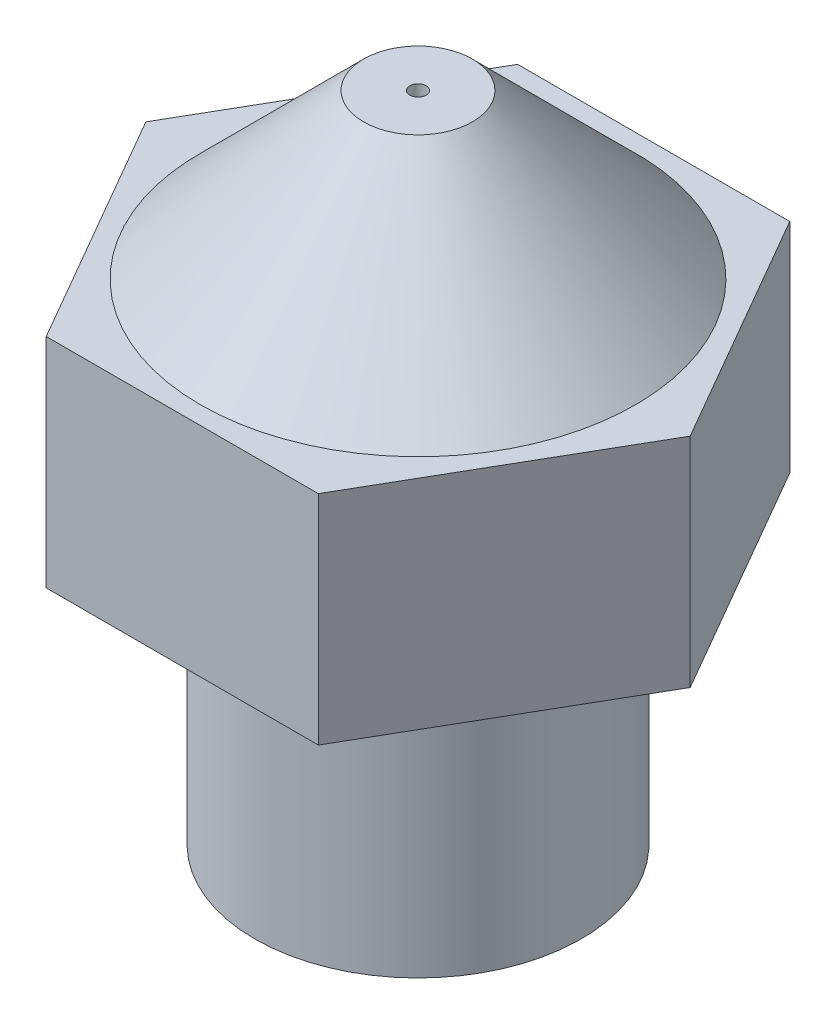
ISO-10303-21;
HEADER;
FILE_DESCRIPTION(('STEP AP214'),'2;1');
FILE_NAME('part.step','',(''),(''),'','','');
FILE_SCHEMA(('AUTOMOTIVE_DESIGN { 1 0 10303 214 1 1 1 1 }'));
ENDSEC;
DATA;
#1=APPLICATION_CONTEXT('core data for automotive mechanical design processes');
#2=APPLICATION_PROTOCOL_DEFINITION('international standard','automotive_design',2000,#1);
#3=PRODUCT_CONTEXT('',#1,'mechanical');
#4=PRODUCT('Part','Part','',(#3));
#5=PRODUCT_RELATED_PRODUCT_CATEGORY('part','',(#4));
#6=PRODUCT_DEFINITION_FORMATION('','',#4);
#7=PRODUCT_DEFINITION_CONTEXT('part definition',#1,'design');
#8=PRODUCT_DEFINITION('design','',#6,#7);
#9=PRODUCT_DEFINITION_SHAPE('','',#8);
#10=(LENGTH_UNIT() NAMED_UNIT(*) SI_UNIT(.MILLI.,.METRE.));
#11=(NAMED_UNIT(*) PLANE_ANGLE_UNIT() SI_UNIT($,.RADIAN.));
#12=(NAMED_UNIT(*) SI_UNIT($,.STERADIAN.) SOLID_ANGLE_UNIT());
#13=UNCERTAINTY_MEASURE_WITH_UNIT(LENGTH_MEASURE(1.E-05),#10,'distance_accuracy_value','');
#14=(GEOMETRIC_REPRESENTATION_CONTEXT(3) GLOBAL_UNCERTAINTY_ASSIGNED_CONTEXT((#13)) GLOBAL_UNIT_ASSIGNED_CONTEXT((#10,
#11,#12)) REPRESENTATION_CONTEXT('',''));
#15=CARTESIAN_POINT('',(0.,0.,0.));
#16=DIRECTION('',(0.,0.,1.));
#17=DIRECTION('',(1.,0.,0.));
#18=AXIS2_PLACEMENT_3D('',#15,#16,#17);
#19=CARTESIAN_POINT('',(0.,-38.,0.));
#20=DIRECTION('',(0.,1.,0.));
#21=DIRECTION('',(0.,0.,1.));
#22=AXIS2_PLACEMENT_3D('',#19,#20,#21);
#23=CYLINDRICAL_SURFACE('',#22,0.150000000000001);
#24=CARTESIAN_POINT('',(0.,12.,0.));
#25=DIRECTION('',(0.,1.,0.));
#26=DIRECTION('',(0.,0.,1.));
#27=AXIS2_PLACEMENT_3D('',#24,#25,#26);
#28=CIRCLE('',#27,0.150000000000001);
#29=CARTESIAN_POINT('',(0.,12.,0.150000000000001));
#30=VERTEX_POINT('',#29);
#31=EDGE_CURVE('E144',#30,#30,#28,.T.);
#32=ORIENTED_EDGE('',*,*,#31,.T.);
#33=EDGE_LOOP('',(#32));
#34=FACE_BOUND('',#33,.T.);
#35=CARTESIAN_POINT('',(0.,5.,0.));
#36=DIRECTION('',(0.,-1.,0.));
#37=DIRECTION('',(0.,0.,-1.));
#38=AXIS2_PLACEMENT_3D('',#35,#36,#37);
#39=CIRCLE('',#38,0.150000000000001);
#40=CARTESIAN_POINT('',(0.,5.,-0.150000000000001));
#41=VERTEX_POINT('',#40);
#42=EDGE_CURVE('E37',#41,#41,#39,.F.);
#43=ORIENTED_EDGE('',*,*,#42,.F.);
#44=EDGE_LOOP('',(#43));
#45=FACE_BOUND('',#44,.T.);
#46=ADVANCED_FACE('F33',(#34,#45),#23,.F.);
#47=CARTESIAN_POINT('',(0.,5.,0.));
#48=DIRECTION('',(0.,-1.,0.));
#49=DIRECTION('',(0.,0.,-1.));
#50=AXIS2_PLACEMENT_3D('',#47,#48,#49);
#51=CYLINDRICAL_SURFACE('',#50,3.);
#52=CARTESIAN_POINT('',(0.,5.,0.));
#53=DIRECTION('',(0.,1.,0.));
#54=DIRECTION('',(0.,0.,1.));
#55=AXIS2_PLACEMENT_3D('',#52,#53,#54);
#56=CIRCLE('',#55,3.);
#57=CARTESIAN_POINT('',(0.,5.,3.));
#58=VERTEX_POINT('',#57);
#59=EDGE_CURVE('E11',#58,#58,#56,.T.);
#60=ORIENTED_EDGE('',*,*,#59,.F.);
#61=EDGE_LOOP('',(#60));
#62=FACE_BOUND('',#61,.T.);
#63=CARTESIAN_POINT('',(0.,0.,0.));
#64=DIRECTION('',(0.,1.,0.));
#65=DIRECTION('',(0.,0.,1.));
#66=AXIS2_PLACEMENT_3D('',#63,#64,#65);
#67=CIRCLE('',#66,3.);
#68=CARTESIAN_POINT('',(0.,0.,3.));
#69=VERTEX_POINT('',#68);
#70=EDGE_CURVE('E43',#69,#69,#67,.T.);
#71=ORIENTED_EDGE('',*,*,#70,.T.);
#72=EDGE_LOOP('',(#71));
#73=FACE_BOUND('',#72,.T.);
#74=ADVANCED_FACE('F183',(#62,#73),#51,.T.);
#75=CARTESIAN_POINT('',(0.,0.,0.));
#76=DIRECTION('',(0.,1.,0.));
#77=DIRECTION('',(0.,0.,1.));
#78=AXIS2_PLACEMENT_3D('',#75,#76,#77);
#79=PLANE('',#78);
#80=CARTESIAN_POINT('',(0.,0.,0.));
#81=DIRECTION('',(0.,-1.,0.));
#82=DIRECTION('',(0.,0.,-1.));
#83=AXIS2_PLACEMENT_3D('',#80,#81,#82);
#84=CIRCLE('',#83,1.5);
#85=CARTESIAN_POINT('',(0.,0.,-1.5));
#86=VERTEX_POINT('',#85);
#87=EDGE_CURVE('E156',#86,#86,#84,.T.);
#88=ORIENTED_EDGE('',*,*,#87,.F.);
#89=EDGE_LOOP('',(#88));
#90=FACE_BOUND('',#89,.T.);
#91=ORIENTED_EDGE('',*,*,#70,.F.);
#92=EDGE_LOOP('',(#91));
#93=FACE_BOUND('',#92,.T.);
#94=ADVANCED_FACE('F188',(#90,#93),#79,.F.);
#95=CARTESIAN_POINT('',(2.5,9.,4.33012701892219));
#96=DIRECTION('',(-0.866025403784439,0.,-0.5));
#97=DIRECTION('',(-0.5,0.,0.866025403784439));
#98=AXIS2_PLACEMENT_3D('',#95,#96,#97);
#99=PLANE('',#98);
#100=DIRECTION('',(0.5,0.,-0.866025403784439));
#101=VECTOR('',#100,1.);
#102=CARTESIAN_POINT('',(2.5,5.,4.33012701892219));
#103=LINE('',#102,#101);
#104=CARTESIAN_POINT('',(2.5,5.,4.33012701892219));
#105=VERTEX_POINT('',#104);
#106=CARTESIAN_POINT('',(5.,5.,0.));
#107=VERTEX_POINT('',#106);
#108=EDGE_CURVE('E121',#105,#107,#103,.T.);
#109=ORIENTED_EDGE('',*,*,#108,.T.);
#110=DIRECTION('',(0.,-1.,0.));
#111=VECTOR('',#110,1.);
#112=CARTESIAN_POINT('',(5.,9.,0.));
#113=LINE('',#112,#111);
#114=CARTESIAN_POINT('',(5.,9.,0.));
#115=VERTEX_POINT('',#114);
#116=EDGE_CURVE('E139',#115,#107,#113,.T.);
#117=ORIENTED_EDGE('',*,*,#116,.F.);
#118=DIRECTION('',(0.5,0.,-0.866025403784439));
#119=VECTOR('',#118,1.);
#120=CARTESIAN_POINT('',(2.5,9.,4.33012701892219));
#121=LINE('',#120,#119);
#122=CARTESIAN_POINT('',(2.5,9.,4.33012701892219));
#123=VERTEX_POINT('',#122);
#124=EDGE_CURVE('E132',#123,#115,#121,.T.);
#125=ORIENTED_EDGE('',*,*,#124,.F.);
#126=DIRECTION('',(0.,-1.,0.));
#127=VECTOR('',#126,1.);
#128=CARTESIAN_POINT('',(2.5,9.,4.33012701892219));
#129=LINE('',#128,#127);
#130=EDGE_CURVE('E117',#123,#105,#129,.T.);
#131=ORIENTED_EDGE('',*,*,#130,.T.);
#132=EDGE_LOOP('',(#109,#117,#125,#131));
#133=FACE_BOUND('',#132,.T.);
#134=ADVANCED_FACE('F170',(#133),#99,.F.);
#135=CARTESIAN_POINT('',(5.,9.,0.));
#136=DIRECTION('',(-0.866025403784439,0.,0.5));
#137=DIRECTION('',(0.5,0.,0.866025403784439));
#138=AXIS2_PLACEMENT_3D('',#135,#136,#137);
#139=PLANE('',#138);
#140=DIRECTION('',(-0.5,0.,-0.866025403784439));
#141=VECTOR('',#140,1.);
#142=CARTESIAN_POINT('',(5.,5.,0.));
#143=LINE('',#142,#141);
#144=CARTESIAN_POINT('',(2.5,5.,-4.33012701892219));
#145=VERTEX_POINT('',#144);
#146=EDGE_CURVE('E124',#107,#145,#143,.T.);
#147=ORIENTED_EDGE('',*,*,#146,.T.);
#148=DIRECTION('',(0.,-1.,0.));
#149=VECTOR('',#148,1.);
#150=CARTESIAN_POINT('',(2.5,9.,-4.33012701892219));
#151=LINE('',#150,#149);
#152=CARTESIAN_POINT('',(2.5,9.,-4.33012701892219));
#153=VERTEX_POINT('',#152);
#154=EDGE_CURVE('E136',#153,#145,#151,.T.);
#155=ORIENTED_EDGE('',*,*,#154,.F.);
#156=DIRECTION('',(-0.5,0.,-0.866025403784439));
#157=VECTOR('',#156,1.);
#158=CARTESIAN_POINT('',(5.,9.,0.));
#159=LINE('',#158,#157);
#160=EDGE_CURVE('E90',#115,#153,#159,.T.);
#161=ORIENTED_EDGE('',*,*,#160,.F.);
#162=ORIENTED_EDGE('',*,*,#116,.T.);
#163=EDGE_LOOP('',(#147,#155,#161,#162));
#164=FACE_BOUND('',#163,.T.);
#165=ADVANCED_FACE('F162',(#164),#139,.F.);
#166=CARTESIAN_POINT('',(2.5,9.,-4.33012701892219));
#167=DIRECTION('',(0.,0.,1.));
#168=DIRECTION('',(1.,0.,0.));
#169=AXIS2_PLACEMENT_3D('',#166,#167,#168);
#170=PLANE('',#169);
#171=DIRECTION('',(-1.,0.,0.));
#172=VECTOR('',#171,1.);
#173=CARTESIAN_POINT('',(2.5,5.,-4.33012701892219));
#174=LINE('',#173,#172);
#175=CARTESIAN_POINT('',(-2.5,5.,-4.33012701892219));
#176=VERTEX_POINT('',#175);
#177=EDGE_CURVE('E127',#145,#176,#174,.T.);
#178=ORIENTED_EDGE('',*,*,#177,.T.);
#179=DIRECTION('',(0.,-1.,0.));
#180=VECTOR('',#179,1.);
#181=CARTESIAN_POINT('',(-2.5,9.,-4.33012701892219));
#182=LINE('',#181,#180);
#183=CARTESIAN_POINT('',(-2.5,9.,-4.33012701892219));
#184=VERTEX_POINT('',#183);
#185=EDGE_CURVE('E112',#184,#176,#182,.T.);
#186=ORIENTED_EDGE('',*,*,#185,.F.);
#187=DIRECTION('',(-1.,0.,0.));
#188=VECTOR('',#187,1.);
#189=CARTESIAN_POINT('',(2.5,9.,-4.33012701892219));
#190=LINE('',#189,#188);
#191=EDGE_CURVE('E103',#153,#184,#190,.T.);
#192=ORIENTED_EDGE('',*,*,#191,.F.);
#193=ORIENTED_EDGE('',*,*,#154,.T.);
#194=EDGE_LOOP('',(#178,#186,#192,#193));
#195=FACE_BOUND('',#194,.T.);
#196=ADVANCED_FACE('F165',(#195),#170,.F.);
#197=CARTESIAN_POINT('',(-2.5,9.,-4.33012701892219));
#198=DIRECTION('',(0.866025403784439,0.,0.5));
#199=DIRECTION('',(0.5,0.,-0.866025403784438));
#200=AXIS2_PLACEMENT_3D('',#197,#198,#199);
#201=PLANE('',#200);
#202=DIRECTION('',(-0.5,0.,0.866025403784438));
#203=VECTOR('',#202,1.);
#204=CARTESIAN_POINT('',(-2.5,5.,-4.33012701892219));
#205=LINE('',#204,#203);
#206=CARTESIAN_POINT('',(-5.,5.,0.));
#207=VERTEX_POINT('',#206);
#208=EDGE_CURVE('E111',#176,#207,#205,.T.);
#209=ORIENTED_EDGE('',*,*,#208,.T.);
#210=DIRECTION('',(0.,-1.,0.));
#211=VECTOR('',#210,1.);
#212=CARTESIAN_POINT('',(-5.,9.,0.));
#213=LINE('',#212,#211);
#214=CARTESIAN_POINT('',(-5.,9.,0.));
#215=VERTEX_POINT('',#214);
#216=EDGE_CURVE('E108',#215,#207,#213,.T.);
#217=ORIENTED_EDGE('',*,*,#216,.F.);
#218=DIRECTION('',(-0.5,0.,0.866025403784438));
#219=VECTOR('',#218,1.);
#220=CARTESIAN_POINT('',(-2.5,9.,-4.33012701892219));
#221=LINE('',#220,#219);
#222=EDGE_CURVE('E97',#184,#215,#221,.T.);
#223=ORIENTED_EDGE('',*,*,#222,.F.);
#224=ORIENTED_EDGE('',*,*,#185,.T.);
#225=EDGE_LOOP('',(#209,#217,#223,#224));
#226=FACE_BOUND('',#225,.T.);
#227=ADVANCED_FACE('F109',(#226),#201,.F.);
#228=CARTESIAN_POINT('',(-5.,9.,0.));
#229=DIRECTION('',(0.866025403784439,0.,-0.5));
#230=DIRECTION('',(-0.5,0.,-0.866025403784439));
#231=AXIS2_PLACEMENT_3D('',#228,#229,#230);
#232=PLANE('',#231);
#233=DIRECTION('',(0.5,0.,0.866025403784439));
#234=VECTOR('',#233,1.);
#235=CARTESIAN_POINT('',(-5.,5.,0.));
#236=LINE('',#235,#234);
#237=CARTESIAN_POINT('',(-2.5,5.,4.33012701892219));
#238=VERTEX_POINT('',#237);
#239=EDGE_CURVE('E75',#207,#238,#236,.T.);
#240=ORIENTED_EDGE('',*,*,#239,.T.);
#241=DIRECTION('',(0.,-1.,0.));
#242=VECTOR('',#241,1.);
#243=CARTESIAN_POINT('',(-2.5,9.,4.33012701892219));
#244=LINE('',#243,#242);
#245=CARTESIAN_POINT('',(-2.5,9.,4.33012701892219));
#246=VERTEX_POINT('',#245);
#247=EDGE_CURVE('E113',#246,#238,#244,.T.);
#248=ORIENTED_EDGE('',*,*,#247,.F.);
#249=DIRECTION('',(0.5,0.,0.866025403784439));
#250=VECTOR('',#249,1.);
#251=CARTESIAN_POINT('',(-5.,9.,0.));
#252=LINE('',#251,#250);
#253=EDGE_CURVE('E101',#215,#246,#252,.T.);
#254=ORIENTED_EDGE('',*,*,#253,.F.);
#255=ORIENTED_EDGE('',*,*,#216,.T.);
#256=EDGE_LOOP('',(#240,#248,#254,#255));
#257=FACE_BOUND('',#256,.T.);
#258=ADVANCED_FACE('F115',(#257),#232,.F.);
#259=CARTESIAN_POINT('',(-2.5,9.,4.33012701892219));
#260=DIRECTION('',(0.,0.,-1.));
#261=DIRECTION('',(-1.,0.,0.));
#262=AXIS2_PLACEMENT_3D('',#259,#260,#261);
#263=PLANE('',#262);
#264=DIRECTION('',(1.,0.,0.));
#265=VECTOR('',#264,1.);
#266=CARTESIAN_POINT('',(-2.5,5.,4.33012701892219));
#267=LINE('',#266,#265);
#268=EDGE_CURVE('E81',#238,#105,#267,.T.);
#269=ORIENTED_EDGE('',*,*,#268,.T.);
#270=ORIENTED_EDGE('',*,*,#130,.F.);
#271=DIRECTION('',(1.,0.,0.));
#272=VECTOR('',#271,1.);
#273=CARTESIAN_POINT('',(-2.5,9.,4.33012701892219));
#274=LINE('',#273,#272);
#275=EDGE_CURVE('E52',#246,#123,#274,.T.);
#276=ORIENTED_EDGE('',*,*,#275,.F.);
#277=ORIENTED_EDGE('',*,*,#247,.T.);
#278=EDGE_LOOP('',(#269,#270,#276,#277));
#279=FACE_BOUND('',#278,.T.);
#280=ADVANCED_FACE('F171',(#279),#263,.F.);
#281=CARTESIAN_POINT('',(0.,9.,0.));
#282=DIRECTION('',(0.,1.,0.));
#283=DIRECTION('',(0.,0.,1.));
#284=AXIS2_PLACEMENT_3D('',#281,#282,#283);
#285=PLANE('',#284);
#286=CARTESIAN_POINT('',(0.,9.,0.));
#287=DIRECTION('',(0.,1.,0.));
#288=DIRECTION('',(0.,0.,1.));
#289=AXIS2_PLACEMENT_3D('',#286,#287,#288);
#290=CIRCLE('',#289,4.00000000000001);
#291=CARTESIAN_POINT('',(0.,9.,4.00000000000001));
#292=VERTEX_POINT('',#291);
#293=EDGE_CURVE('E142',#292,#292,#290,.T.);
#294=ORIENTED_EDGE('',*,*,#293,.F.);
#295=EDGE_LOOP('',(#294));
#296=FACE_BOUND('',#295,.T.);
#297=ORIENTED_EDGE('',*,*,#124,.T.);
#298=ORIENTED_EDGE('',*,*,#160,.T.);
#299=ORIENTED_EDGE('',*,*,#191,.T.);
#300=ORIENTED_EDGE('',*,*,#222,.T.);
#301=ORIENTED_EDGE('',*,*,#253,.T.);
#302=ORIENTED_EDGE('',*,*,#275,.T.);
#303=EDGE_LOOP('',(#297,#298,#299,#300,#301,#302));
#304=FACE_BOUND('',#303,.T.);
#305=ADVANCED_FACE('F99',(#296,#304),#285,.T.);
#306=CARTESIAN_POINT('',(0.,5.,0.));
#307=DIRECTION('',(0.,1.,0.));
#308=DIRECTION('',(0.,0.,1.));
#309=AXIS2_PLACEMENT_3D('',#306,#307,#308);
#310=PLANE('',#309);
#311=ORIENTED_EDGE('',*,*,#59,.T.);
#312=EDGE_LOOP('',(#311));
#313=FACE_BOUND('',#312,.T.);
#314=ORIENTED_EDGE('',*,*,#108,.F.);
#315=ORIENTED_EDGE('',*,*,#268,.F.);
#316=ORIENTED_EDGE('',*,*,#239,.F.);
#317=ORIENTED_EDGE('',*,*,#208,.F.);
#318=ORIENTED_EDGE('',*,*,#177,.F.);
#319=ORIENTED_EDGE('',*,*,#146,.F.);
#320=EDGE_LOOP('',(#314,#315,#316,#317,#318,#319));
#321=FACE_BOUND('',#320,.T.);
#322=ADVANCED_FACE('F168',(#313,#321),#310,.F.);
#323=CARTESIAN_POINT('',(0.,12.,0.));
#324=DIRECTION('',(0.,-1.,0.));
#325=DIRECTION('',(0.,0.,1.));
#326=AXIS2_PLACEMENT_3D('',#323,#324,#325);
#327=CONICAL_SURFACE('',#326,1.,0.78539816339745);
#328=CARTESIAN_POINT('',(0.,12.,0.));
#329=DIRECTION('',(0.,1.,0.));
#330=DIRECTION('',(0.,0.,1.));
#331=AXIS2_PLACEMENT_3D('',#328,#329,#330);
#332=CIRCLE('',#331,1.);
#333=CARTESIAN_POINT('',(0.,12.,1.));
#334=VERTEX_POINT('',#333);
#335=EDGE_CURVE('E125',#334,#334,#332,.T.);
#336=CARTESIAN_POINT('',(0.,12.,1.));
#337=CARTESIAN_POINT('',(0.,11.96875,1.03125));
#338=CARTESIAN_POINT('',(0.,11.9375,1.0625));
#339=CARTESIAN_POINT('',(0.,11.875,1.125));
#340=CARTESIAN_POINT('',(0.,11.84375,1.15625));
#341=CARTESIAN_POINT('',(0.,11.78125,1.21875));
#342=CARTESIAN_POINT('',(0.,11.75,1.25));
#343=CARTESIAN_POINT('',(0.,11.6875,1.3125));
#344=CARTESIAN_POINT('',(0.,11.65625,1.34375));
#345=CARTESIAN_POINT('',(0.,11.59375,1.40625));
#346=CARTESIAN_POINT('',(0.,11.5625,1.4375));
#347=CARTESIAN_POINT('',(0.,11.5,1.5));
#348=CARTESIAN_POINT('',(0.,11.46875,1.53125));
#349=CARTESIAN_POINT('',(0.,11.40625,1.59375));
#350=CARTESIAN_POINT('',(0.,11.375,1.625));
#351=CARTESIAN_POINT('',(0.,11.3125,1.6875));
#352=CARTESIAN_POINT('',(0.,11.28125,1.71875));
#353=CARTESIAN_POINT('',(0.,11.21875,1.78125));
#354=CARTESIAN_POINT('',(0.,11.1875,1.8125));
#355=CARTESIAN_POINT('',(0.,11.125,1.875));
#356=CARTESIAN_POINT('',(0.,11.09375,1.90625));
#357=CARTESIAN_POINT('',(0.,11.03125,1.96875));
#358=CARTESIAN_POINT('',(0.,11.,2.));
#359=CARTESIAN_POINT('',(0.,10.9375,2.0625));
#360=CARTESIAN_POINT('',(0.,10.90625,2.09375));
#361=CARTESIAN_POINT('',(0.,10.84375,2.15625));
#362=CARTESIAN_POINT('',(0.,10.8125,2.1875));
#363=CARTESIAN_POINT('',(0.,10.75,2.25));
#364=CARTESIAN_POINT('',(0.,10.71875,2.28125000000001));
#365=CARTESIAN_POINT('',(0.,10.65625,2.34375000000001));
#366=CARTESIAN_POINT('',(0.,10.625,2.37500000000001));
#367=CARTESIAN_POINT('',(0.,10.5625,2.43750000000001));
#368=CARTESIAN_POINT('',(0.,10.53125,2.46875000000001));
#369=CARTESIAN_POINT('',(0.,10.46875,2.53125000000001));
#370=CARTESIAN_POINT('',(0.,10.4375,2.56250000000001));
#371=CARTESIAN_POINT('',(0.,10.375,2.62500000000001));
#372=CARTESIAN_POINT('',(0.,10.34375,2.65625000000001));
#373=CARTESIAN_POINT('',(0.,10.28125,2.71875000000001));
#374=CARTESIAN_POINT('',(0.,10.25,2.75000000000001));
#375=CARTESIAN_POINT('',(0.,10.1875,2.81250000000001));
#376=CARTESIAN_POINT('',(0.,10.15625,2.84375000000001));
#377=CARTESIAN_POINT('',(0.,10.09375,2.90625000000001));
#378=CARTESIAN_POINT('',(0.,10.0625,2.93750000000001));
#379=CARTESIAN_POINT('',(0.,10.,3.00000000000001));
#380=CARTESIAN_POINT('',(0.,9.96875,3.03125000000001));
#381=CARTESIAN_POINT('',(0.,9.90625,3.09375000000001));
#382=CARTESIAN_POINT('',(0.,9.875,3.12500000000001));
#383=CARTESIAN_POINT('',(0.,9.8125,3.18750000000001));
#384=CARTESIAN_POINT('',(0.,9.78125,3.21875000000001));
#385=CARTESIAN_POINT('',(0.,9.71875,3.28125000000001));
#386=CARTESIAN_POINT('',(0.,9.6875,3.31250000000001));
#387=CARTESIAN_POINT('',(0.,9.625,3.37500000000001));
#388=CARTESIAN_POINT('',(0.,9.59375,3.40625000000001));
#389=CARTESIAN_POINT('',(0.,9.53125,3.46875000000001));
#390=CARTESIAN_POINT('',(0.,9.5,3.50000000000001));
#391=CARTESIAN_POINT('',(0.,9.4375,3.56250000000001));
#392=CARTESIAN_POINT('',(0.,9.40625,3.59375000000001));
#393=CARTESIAN_POINT('',(0.,9.34375,3.65625000000001));
#394=CARTESIAN_POINT('',(0.,9.3125,3.68750000000001));
#395=CARTESIAN_POINT('',(0.,9.25,3.75000000000001));
#396=CARTESIAN_POINT('',(0.,9.21875,3.78125000000001));
#397=CARTESIAN_POINT('',(0.,9.15625,3.84375000000001));
#398=CARTESIAN_POINT('',(0.,9.125,3.87500000000001));
#399=CARTESIAN_POINT('',(0.,9.0625,3.93750000000001));
#400=CARTESIAN_POINT('',(0.,9.03125,3.96875000000001));
#401=CARTESIAN_POINT('',(0.,9.,4.00000000000001));
#402=B_SPLINE_CURVE_WITH_KNOTS('',3,(#336,#337,#338,#339,#340,#341,#342,#343,#344,#345,#346,
#347,#348,#349,#350,#351,#352,#353,#354,#355,#356,#357,#358,#359,#360,#361,#362,#363,#364,#365,
#366,#367,#368,#369,#370,#371,#372,#373,#374,#375,#376,#377,#378,#379,#380,#381,#382,#383,#384,
#385,#386,#387,#388,#389,#390,#391,#392,#393,#394,#395,#396,#397,#398,#399,#400,#401),
.UNSPECIFIED.,.F.,.F.,(4,2,2,2,2,2,2,2,2,2,2,2,2,2,2,2,2,2,2,2,2,2,2,2,2,2,2,2,2,2,2,2,4),(0.,
0.132582521472477,0.265165042944955,0.397747564417433,0.53033008588991,0.662912607362388,
0.795495128834866,0.928077650307344,1.06066017177982,1.1932426932523,1.32582521472478,
1.45840773619726,1.59099025766973,1.72357277914221,1.85615530061469,1.98873782208717,
2.12132034355965,2.25390286503212,2.3864853865046,2.51906790797708,2.65165042944956,
2.78423295092203,2.91681547239451,3.04939799386699,3.18198051533947,3.31456303681194,
3.44714555828442,3.5797280797569,3.71231060122938,3.84489312270186,3.97747564417433,
4.11005816564681,4.24264068711929),.UNSPECIFIED.);
#403=EDGE_CURVE('BSEAM35',#334,#292,#402,.T.);
#404=ORIENTED_EDGE('',*,*,#335,.F.);
#405=ORIENTED_EDGE('',*,*,#293,.T.);
#406=ORIENTED_EDGE('',*,*,#403,.T.);
#407=ORIENTED_EDGE('',*,*,#403,.F.);
#408=EDGE_LOOP('',(#404,#406,#405,#407));
#409=FACE_BOUND('',#408,.T.);
#410=ADVANCED_FACE('F35',(#409),#327,.T.);
#411=CARTESIAN_POINT('',(0.,12.,0.));
#412=DIRECTION('',(0.,1.,0.));
#413=DIRECTION('',(0.,0.,1.));
#414=AXIS2_PLACEMENT_3D('',#411,#412,#413);
#415=PLANE('',#414);
#416=ORIENTED_EDGE('',*,*,#31,.F.);
#417=EDGE_LOOP('',(#416));
#418=FACE_BOUND('',#417,.T.);
#419=ORIENTED_EDGE('',*,*,#335,.T.);
#420=EDGE_LOOP('',(#419));
#421=FACE_BOUND('',#420,.T.);
#422=ADVANCED_FACE('F195',(#418,#421),#415,.T.);
#423=CARTESIAN_POINT('',(0.,5.,0.));
#424=DIRECTION('',(0.,-1.,0.));
#425=DIRECTION('',(0.,0.,-1.));
#426=AXIS2_PLACEMENT_3D('',#423,#424,#425);
#427=PLANE('',#426);
#428=CARTESIAN_POINT('',(0.,5.,0.));
#429=DIRECTION('',(0.,-1.,0.));
#430=DIRECTION('',(0.,0.,-1.));
#431=AXIS2_PLACEMENT_3D('',#428,#429,#430);
#432=CIRCLE('',#431,1.5);
#433=CARTESIAN_POINT('',(0.,5.,-1.5));
#434=VERTEX_POINT('',#433);
#435=EDGE_CURVE('E154',#434,#434,#432,.T.);
#436=ORIENTED_EDGE('',*,*,#435,.T.);
#437=EDGE_LOOP('',(#436));
#438=FACE_BOUND('',#437,.T.);
#439=ORIENTED_EDGE('',*,*,#42,.T.);
#440=EDGE_LOOP('',(#439));
#441=FACE_BOUND('',#440,.T.);
#442=ADVANCED_FACE('F197',(#438,#441),#427,.T.);
#443=CARTESIAN_POINT('',(0.,5.,0.));
#444=DIRECTION('',(0.,-1.,0.));
#445=DIRECTION('',(0.,0.,-1.));
#446=AXIS2_PLACEMENT_3D('',#443,#444,#445);
#447=CYLINDRICAL_SURFACE('',#446,1.5);
#448=ORIENTED_EDGE('',*,*,#435,.F.);
#449=EDGE_LOOP('',(#448));
#450=FACE_BOUND('',#449,.T.);
#451=ORIENTED_EDGE('',*,*,#87,.T.);
#452=EDGE_LOOP('',(#451));
#453=FACE_BOUND('',#452,.T.);
#454=ADVANCED_FACE('F193',(#450,#453),#447,.F.);
#455=CLOSED_SHELL('',(#46,#74,#94,#134,#165,#196,#227,#258,#280,#305,#322,#410,#422,#442,#454));
#456=MANIFOLD_SOLID_BREP('B2',#455);
#457=ADVANCED_BREP_SHAPE_REPRESENTATION('',(#18,#456),#14);
#458=SHAPE_DEFINITION_REPRESENTATION(#9,#457);
ENDSEC;
END-ISO-10303-21;
